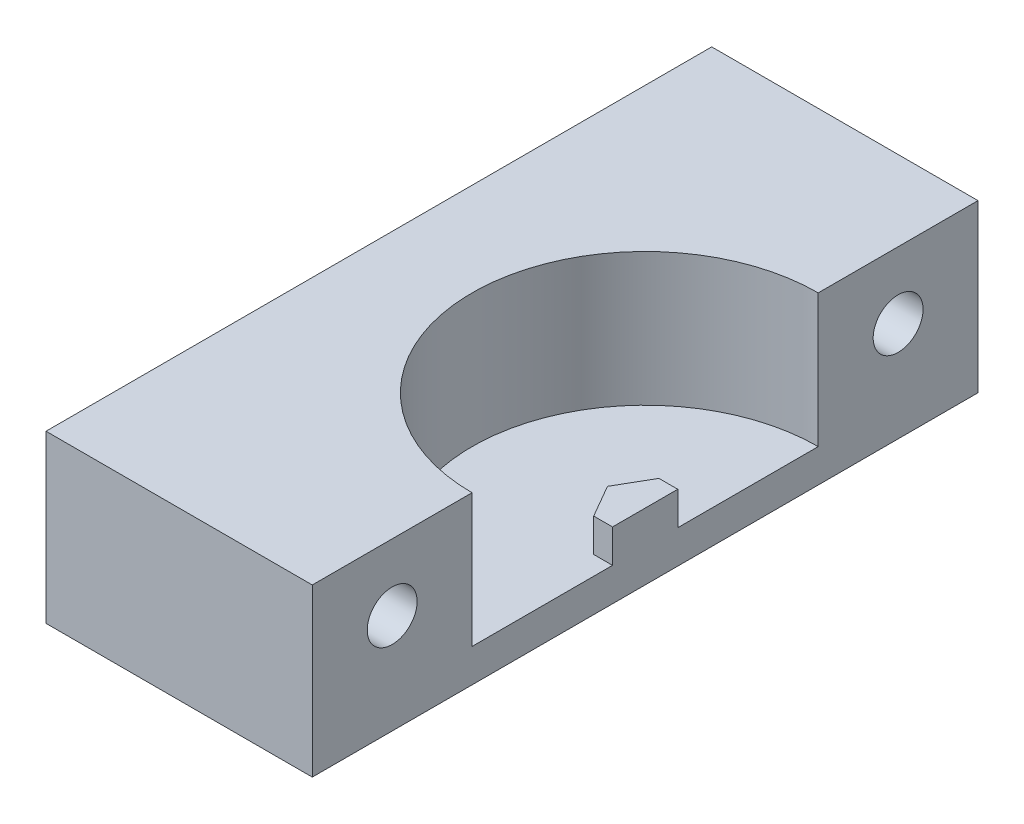
ISO-10303-21;
HEADER;
FILE_DESCRIPTION(('STEP AP214'),'2;1');
FILE_NAME('part.step','',(''),(''),'','','');
FILE_SCHEMA(('AUTOMOTIVE_DESIGN { 1 0 10303 214 1 1 1 1 }'));
ENDSEC;
DATA;
#1=APPLICATION_CONTEXT('core data for automotive mechanical design processes');
#2=APPLICATION_PROTOCOL_DEFINITION('international standard','automotive_design',2000,#1);
#3=PRODUCT_CONTEXT('',#1,'mechanical');
#4=PRODUCT('Part','Part','',(#3));
#5=PRODUCT_RELATED_PRODUCT_CATEGORY('part','',(#4));
#6=PRODUCT_DEFINITION_FORMATION('','',#4);
#7=PRODUCT_DEFINITION_CONTEXT('part definition',#1,'design');
#8=PRODUCT_DEFINITION('design','',#6,#7);
#9=PRODUCT_DEFINITION_SHAPE('','',#8);
#10=(LENGTH_UNIT() NAMED_UNIT(*) SI_UNIT(.MILLI.,.METRE.));
#11=(NAMED_UNIT(*) PLANE_ANGLE_UNIT() SI_UNIT($,.RADIAN.));
#12=(NAMED_UNIT(*) SI_UNIT($,.STERADIAN.) SOLID_ANGLE_UNIT());
#13=UNCERTAINTY_MEASURE_WITH_UNIT(LENGTH_MEASURE(1.E-05),#10,'distance_accuracy_value','');
#14=(GEOMETRIC_REPRESENTATION_CONTEXT(3) GLOBAL_UNCERTAINTY_ASSIGNED_CONTEXT((#13)) GLOBAL_UNIT_ASSIGNED_CONTEXT((#10,
#11,#12)) REPRESENTATION_CONTEXT('',''));
#15=CARTESIAN_POINT('',(0.,0.,0.));
#16=DIRECTION('',(0.,0.,1.));
#17=DIRECTION('',(1.,0.,0.));
#18=AXIS2_PLACEMENT_3D('',#15,#16,#17);
#19=CARTESIAN_POINT('',(0.,0.,0.));
#20=DIRECTION('',(0.,-1.,0.));
#21=DIRECTION('',(0.,0.,-1.));
#22=AXIS2_PLACEMENT_3D('',#19,#20,#21);
#23=PLANE('',#22);
#24=DIRECTION('',(-1.,0.,0.));
#25=VECTOR('',#24,1.);
#26=CARTESIAN_POINT('',(0.,0.,-6.223));
#27=LINE('',#26,#25);
#28=CARTESIAN_POINT('',(0.,0.,-6.223));
#29=VERTEX_POINT('',#28);
#30=CARTESIAN_POINT('',(-3.59285072516704,0.,-6.223));
#31=VERTEX_POINT('',#30);
#32=EDGE_CURVE('E212',#29,#31,#27,.T.);
#33=ORIENTED_EDGE('',*,*,#32,.F.);
#34=DIRECTION('',(0.,0.,1.));
#35=VECTOR('',#34,1.);
#36=CARTESIAN_POINT('',(0.,0.,63.5));
#37=LINE('',#36,#35);
#38=CARTESIAN_POINT('',(0.,0.,-33.02));
#39=VERTEX_POINT('',#38);
#40=EDGE_CURVE('E74',#39,#29,#37,.T.);
#41=ORIENTED_EDGE('',*,*,#40,.F.);
#42=CARTESIAN_POINT('',(0.,0.,0.));
#43=DIRECTION('',(0.,-1.,0.));
#44=DIRECTION('',(0.,0.,1.));
#45=AXIS2_PLACEMENT_3D('',#42,#43,#44);
#46=CIRCLE('',#45,33.02);
#47=CARTESIAN_POINT('',(0.,0.,33.02));
#48=VERTEX_POINT('',#47);
#49=EDGE_CURVE('E123',#48,#39,#46,.T.);
#50=ORIENTED_EDGE('',*,*,#49,.F.);
#51=CARTESIAN_POINT('',(0.,0.,6.223));
#52=VERTEX_POINT('',#51);
#53=EDGE_CURVE('E81',#52,#48,#37,.T.);
#54=ORIENTED_EDGE('',*,*,#53,.F.);
#55=DIRECTION('',(1.,0.,0.));
#56=VECTOR('',#55,1.);
#57=CARTESIAN_POINT('',(-3.59285072516703,0.,6.223));
#58=LINE('',#57,#56);
#59=CARTESIAN_POINT('',(-3.59285072516703,0.,6.223));
#60=VERTEX_POINT('',#59);
#61=EDGE_CURVE('E163',#60,#52,#58,.T.);
#62=ORIENTED_EDGE('',*,*,#61,.F.);
#63=DIRECTION('',(0.5,0.,0.866025403784438));
#64=VECTOR('',#63,1.);
#65=CARTESIAN_POINT('',(-7.18570145033408,0.,0.));
#66=LINE('',#65,#64);
#67=CARTESIAN_POINT('',(-7.18570145033408,0.,0.));
#68=VERTEX_POINT('',#67);
#69=EDGE_CURVE('E208',#68,#60,#66,.T.);
#70=ORIENTED_EDGE('',*,*,#69,.F.);
#71=DIRECTION('',(-0.5,0.,0.866025403784438));
#72=VECTOR('',#71,1.);
#73=CARTESIAN_POINT('',(-3.59285072516704,0.,-6.223));
#74=LINE('',#73,#72);
#75=EDGE_CURVE('E210',#31,#68,#74,.T.);
#76=ORIENTED_EDGE('',*,*,#75,.F.);
#77=EDGE_LOOP('',(#33,#41,#50,#54,#62,#70,#76));
#78=FACE_BOUND('',#77,.T.);
#79=ADVANCED_FACE('F37',(#78),#23,.F.);
#80=CARTESIAN_POINT('',(0.,25.4,0.));
#81=DIRECTION('',(0.,-1.,0.));
#82=DIRECTION('',(0.,0.,-1.));
#83=AXIS2_PLACEMENT_3D('',#80,#81,#82);
#84=CYLINDRICAL_SURFACE('',#83,33.02);
#85=ORIENTED_EDGE('',*,*,#49,.T.);
#86=DIRECTION('',(0.,-1.,0.));
#87=VECTOR('',#86,1.);
#88=CARTESIAN_POINT('',(0.,25.4,-33.02));
#89=LINE('',#88,#87);
#90=CARTESIAN_POINT('',(0.,25.4,-33.02));
#91=VERTEX_POINT('',#90);
#92=EDGE_CURVE('E11',#91,#39,#89,.T.);
#93=ORIENTED_EDGE('',*,*,#92,.F.);
#94=CARTESIAN_POINT('',(0.,25.4,0.));
#95=DIRECTION('',(0.,-1.,0.));
#96=DIRECTION('',(0.,0.,1.));
#97=AXIS2_PLACEMENT_3D('',#94,#95,#96);
#98=CIRCLE('',#97,33.02);
#99=CARTESIAN_POINT('',(0.,25.4,33.02));
#100=VERTEX_POINT('',#99);
#101=EDGE_CURVE('E126',#100,#91,#98,.T.);
#102=ORIENTED_EDGE('',*,*,#101,.F.);
#103=DIRECTION('',(0.,-1.,0.));
#104=VECTOR('',#103,1.);
#105=CARTESIAN_POINT('',(0.,25.4,33.02));
#106=LINE('',#105,#104);
#107=EDGE_CURVE('E119',#100,#48,#106,.T.);
#108=ORIENTED_EDGE('',*,*,#107,.T.);
#109=EDGE_LOOP('',(#85,#93,#102,#108));
#110=FACE_BOUND('',#109,.T.);
#111=ADVANCED_FACE('F39',(#110),#84,.F.);
#112=CARTESIAN_POINT('',(0.,25.4,-63.5));
#113=DIRECTION('',(0.,0.,1.));
#114=DIRECTION('',(1.,0.,0.));
#115=AXIS2_PLACEMENT_3D('',#112,#113,#114);
#116=PLANE('',#115);
#117=DIRECTION('',(0.,-1.,0.));
#118=VECTOR('',#117,1.);
#119=CARTESIAN_POINT('',(0.,25.4,-63.5));
#120=LINE('',#119,#118);
#121=CARTESIAN_POINT('',(0.,25.4,-63.5));
#122=VERTEX_POINT('',#121);
#123=CARTESIAN_POINT('',(0.,-6.35,-63.5));
#124=VERTEX_POINT('',#123);
#125=EDGE_CURVE('E45',#122,#124,#120,.T.);
#126=ORIENTED_EDGE('',*,*,#125,.T.);
#127=DIRECTION('',(1.,0.,0.));
#128=VECTOR('',#127,1.);
#129=CARTESIAN_POINT('',(-50.8,-6.35,-63.5));
#130=LINE('',#129,#128);
#131=CARTESIAN_POINT('',(-50.8,-6.35,-63.5));
#132=VERTEX_POINT('',#131);
#133=EDGE_CURVE('E139',#132,#124,#130,.T.);
#134=ORIENTED_EDGE('',*,*,#133,.F.);
#135=DIRECTION('',(0.,-1.,0.));
#136=VECTOR('',#135,1.);
#137=CARTESIAN_POINT('',(-50.8,25.4,-63.5));
#138=LINE('',#137,#136);
#139=CARTESIAN_POINT('',(-50.8,25.4,-63.5));
#140=VERTEX_POINT('',#139);
#141=EDGE_CURVE('E113',#140,#132,#138,.T.);
#142=ORIENTED_EDGE('',*,*,#141,.F.);
#143=DIRECTION('',(-1.,0.,0.));
#144=VECTOR('',#143,1.);
#145=CARTESIAN_POINT('',(0.,25.4,-63.5));
#146=LINE('',#145,#144);
#147=EDGE_CURVE('E100',#122,#140,#146,.T.);
#148=ORIENTED_EDGE('',*,*,#147,.F.);
#149=EDGE_LOOP('',(#126,#134,#142,#148));
#150=FACE_BOUND('',#149,.T.);
#151=ADVANCED_FACE('F137',(#150),#116,.F.);
#152=CARTESIAN_POINT('',(-50.8,25.4,-63.5));
#153=DIRECTION('',(1.,0.,0.));
#154=DIRECTION('',(0.,0.,-1.));
#155=AXIS2_PLACEMENT_3D('',#152,#153,#154);
#156=PLANE('',#155);
#157=CARTESIAN_POINT('',(-50.8,12.7,48.26));
#158=DIRECTION('',(1.,0.,0.));
#159=DIRECTION('',(0.,0.,-1.));
#160=AXIS2_PLACEMENT_3D('',#157,#158,#159);
#161=CIRCLE('',#160,4.7625);
#162=CARTESIAN_POINT('',(-50.8,12.7,43.4975));
#163=VERTEX_POINT('',#162);
#164=EDGE_CURVE('E164',#163,#163,#161,.T.);
#165=ORIENTED_EDGE('',*,*,#164,.T.);
#166=EDGE_LOOP('',(#165));
#167=FACE_BOUND('',#166,.T.);
#168=CARTESIAN_POINT('',(-50.8,12.7,-48.26));
#169=DIRECTION('',(1.,0.,0.));
#170=DIRECTION('',(0.,0.,1.));
#171=AXIS2_PLACEMENT_3D('',#168,#169,#170);
#172=CIRCLE('',#171,4.7625);
#173=CARTESIAN_POINT('',(-50.8,12.7,-43.4975));
#174=VERTEX_POINT('',#173);
#175=EDGE_CURVE('E171',#174,#174,#172,.T.);
#176=ORIENTED_EDGE('',*,*,#175,.T.);
#177=EDGE_LOOP('',(#176));
#178=FACE_BOUND('',#177,.T.);
#179=ORIENTED_EDGE('',*,*,#141,.T.);
#180=DIRECTION('',(0.,0.,-1.));
#181=VECTOR('',#180,1.);
#182=CARTESIAN_POINT('',(-50.8,-6.35,63.5));
#183=LINE('',#182,#181);
#184=CARTESIAN_POINT('',(-50.8,-6.35,63.5));
#185=VERTEX_POINT('',#184);
#186=EDGE_CURVE('E109',#185,#132,#183,.T.);
#187=ORIENTED_EDGE('',*,*,#186,.F.);
#188=DIRECTION('',(0.,-1.,0.));
#189=VECTOR('',#188,1.);
#190=CARTESIAN_POINT('',(-50.8,25.4,63.5));
#191=LINE('',#190,#189);
#192=CARTESIAN_POINT('',(-50.8,25.4,63.5));
#193=VERTEX_POINT('',#192);
#194=EDGE_CURVE('E106',#193,#185,#191,.T.);
#195=ORIENTED_EDGE('',*,*,#194,.F.);
#196=DIRECTION('',(0.,0.,1.));
#197=VECTOR('',#196,1.);
#198=CARTESIAN_POINT('',(-50.8,25.4,-63.5));
#199=LINE('',#198,#197);
#200=EDGE_CURVE('E93',#140,#193,#199,.T.);
#201=ORIENTED_EDGE('',*,*,#200,.F.);
#202=EDGE_LOOP('',(#179,#187,#195,#201));
#203=FACE_BOUND('',#202,.T.);
#204=ADVANCED_FACE('F107',(#167,#178,#203),#156,.F.);
#205=CARTESIAN_POINT('',(-50.8,25.4,63.5));
#206=DIRECTION('',(0.,0.,-1.));
#207=DIRECTION('',(-1.,0.,0.));
#208=AXIS2_PLACEMENT_3D('',#205,#206,#207);
#209=PLANE('',#208);
#210=ORIENTED_EDGE('',*,*,#194,.T.);
#211=DIRECTION('',(-1.,0.,0.));
#212=VECTOR('',#211,1.);
#213=CARTESIAN_POINT('',(-50.8,-6.35,63.5));
#214=LINE('',#213,#212);
#215=CARTESIAN_POINT('',(0.,-6.35,63.5));
#216=VERTEX_POINT('',#215);
#217=EDGE_CURVE('E127',#216,#185,#214,.T.);
#218=ORIENTED_EDGE('',*,*,#217,.F.);
#219=DIRECTION('',(0.,-1.,0.));
#220=VECTOR('',#219,1.);
#221=CARTESIAN_POINT('',(0.,25.4,63.5));
#222=LINE('',#221,#220);
#223=CARTESIAN_POINT('',(0.,25.4,63.5));
#224=VERTEX_POINT('',#223);
#225=EDGE_CURVE('E114',#224,#216,#222,.T.);
#226=ORIENTED_EDGE('',*,*,#225,.F.);
#227=DIRECTION('',(1.,0.,0.));
#228=VECTOR('',#227,1.);
#229=CARTESIAN_POINT('',(-50.8,25.4,63.5));
#230=LINE('',#229,#228);
#231=EDGE_CURVE('E97',#193,#224,#230,.T.);
#232=ORIENTED_EDGE('',*,*,#231,.F.);
#233=EDGE_LOOP('',(#210,#218,#226,#232));
#234=FACE_BOUND('',#233,.T.);
#235=ADVANCED_FACE('F116',(#234),#209,.F.);
#236=CARTESIAN_POINT('',(0.,25.4,63.5));
#237=DIRECTION('',(-1.,0.,0.));
#238=DIRECTION('',(0.,0.,1.));
#239=AXIS2_PLACEMENT_3D('',#236,#237,#238);
#240=PLANE('',#239);
#241=CARTESIAN_POINT('',(0.,12.7,48.26));
#242=DIRECTION('',(1.,0.,0.));
#243=DIRECTION('',(0.,0.,-1.));
#244=AXIS2_PLACEMENT_3D('',#241,#242,#243);
#245=CIRCLE('',#244,4.7625);
#246=CARTESIAN_POINT('',(0.,12.7,43.4975));
#247=VERTEX_POINT('',#246);
#248=EDGE_CURVE('E166',#247,#247,#245,.T.);
#249=ORIENTED_EDGE('',*,*,#248,.F.);
#250=EDGE_LOOP('',(#249));
#251=FACE_BOUND('',#250,.T.);
#252=CARTESIAN_POINT('',(0.,12.7,-48.26));
#253=DIRECTION('',(1.,0.,0.));
#254=DIRECTION('',(0.,0.,1.));
#255=AXIS2_PLACEMENT_3D('',#252,#253,#254);
#256=CIRCLE('',#255,4.7625);
#257=CARTESIAN_POINT('',(0.,12.7,-43.4975));
#258=VERTEX_POINT('',#257);
#259=EDGE_CURVE('E179',#258,#258,#256,.T.);
#260=ORIENTED_EDGE('',*,*,#259,.F.);
#261=EDGE_LOOP('',(#260));
#262=FACE_BOUND('',#261,.T.);
#263=ORIENTED_EDGE('',*,*,#225,.T.);
#264=DIRECTION('',(0.,0.,1.));
#265=VECTOR('',#264,1.);
#266=CARTESIAN_POINT('',(0.,-6.35,63.5));
#267=LINE('',#266,#265);
#268=EDGE_CURVE('E145',#124,#216,#267,.T.);
#269=ORIENTED_EDGE('',*,*,#268,.F.);
#270=ORIENTED_EDGE('',*,*,#125,.F.);
#271=DIRECTION('',(0.,0.,-1.));
#272=VECTOR('',#271,1.);
#273=CARTESIAN_POINT('',(0.,25.4,-33.02));
#274=LINE('',#273,#272);
#275=EDGE_CURVE('E154',#91,#122,#274,.T.);
#276=ORIENTED_EDGE('',*,*,#275,.F.);
#277=ORIENTED_EDGE('',*,*,#92,.T.);
#278=ORIENTED_EDGE('',*,*,#40,.T.);
#279=DIRECTION('',(0.,-1.,0.));
#280=VECTOR('',#279,1.);
#281=CARTESIAN_POINT('',(0.,6.35,-6.223));
#282=LINE('',#281,#280);
#283=CARTESIAN_POINT('',(0.,6.35,-6.223));
#284=VERTEX_POINT('',#283);
#285=EDGE_CURVE('E202',#284,#29,#282,.T.);
#286=ORIENTED_EDGE('',*,*,#285,.F.);
#287=DIRECTION('',(0.,0.,-1.));
#288=VECTOR('',#287,1.);
#289=CARTESIAN_POINT('',(0.,6.35,-6.223));
#290=LINE('',#289,#288);
#291=CARTESIAN_POINT('',(0.,6.35,6.223));
#292=VERTEX_POINT('',#291);
#293=EDGE_CURVE('E205',#292,#284,#290,.T.);
#294=ORIENTED_EDGE('',*,*,#293,.F.);
#295=DIRECTION('',(0.,-1.,0.));
#296=VECTOR('',#295,1.);
#297=CARTESIAN_POINT('',(0.,6.35,6.223));
#298=LINE('',#297,#296);
#299=EDGE_CURVE('E52',#292,#52,#298,.T.);
#300=ORIENTED_EDGE('',*,*,#299,.T.);
#301=ORIENTED_EDGE('',*,*,#53,.T.);
#302=ORIENTED_EDGE('',*,*,#107,.F.);
#303=DIRECTION('',(0.,0.,-1.));
#304=VECTOR('',#303,1.);
#305=CARTESIAN_POINT('',(0.,25.4,63.5));
#306=LINE('',#305,#304);
#307=EDGE_CURVE('E61',#224,#100,#306,.T.);
#308=ORIENTED_EDGE('',*,*,#307,.F.);
#309=EDGE_LOOP('',(#263,#269,#270,#276,#277,#278,#286,#294,#300,#301,#302,#308));
#310=FACE_BOUND('',#309,.T.);
#311=ADVANCED_FACE('F147',(#251,#262,#310),#240,.F.);
#312=CARTESIAN_POINT('',(0.,25.4,0.));
#313=DIRECTION('',(0.,1.,0.));
#314=DIRECTION('',(0.,0.,1.));
#315=AXIS2_PLACEMENT_3D('',#312,#313,#314);
#316=PLANE('',#315);
#317=ORIENTED_EDGE('',*,*,#101,.T.);
#318=ORIENTED_EDGE('',*,*,#275,.T.);
#319=ORIENTED_EDGE('',*,*,#147,.T.);
#320=ORIENTED_EDGE('',*,*,#200,.T.);
#321=ORIENTED_EDGE('',*,*,#231,.T.);
#322=ORIENTED_EDGE('',*,*,#307,.T.);
#323=EDGE_LOOP('',(#317,#318,#319,#320,#321,#322));
#324=FACE_BOUND('',#323,.T.);
#325=ADVANCED_FACE('F95',(#324),#316,.T.);
#326=CARTESIAN_POINT('',(0.,-6.35,0.));
#327=DIRECTION('',(0.,-1.,0.));
#328=DIRECTION('',(0.,0.,-1.));
#329=AXIS2_PLACEMENT_3D('',#326,#327,#328);
#330=PLANE('',#329);
#331=ORIENTED_EDGE('',*,*,#186,.T.);
#332=ORIENTED_EDGE('',*,*,#133,.T.);
#333=ORIENTED_EDGE('',*,*,#268,.T.);
#334=ORIENTED_EDGE('',*,*,#217,.T.);
#335=EDGE_LOOP('',(#331,#332,#333,#334));
#336=FACE_BOUND('',#335,.T.);
#337=ADVANCED_FACE('F144',(#336),#330,.T.);
#338=CARTESIAN_POINT('',(-50.8,12.7,-48.26));
#339=DIRECTION('',(1.,0.,0.));
#340=DIRECTION('',(0.,0.,-1.));
#341=AXIS2_PLACEMENT_3D('',#338,#339,#340);
#342=CYLINDRICAL_SURFACE('',#341,4.7625);
#343=ORIENTED_EDGE('',*,*,#175,.F.);
#344=EDGE_LOOP('',(#343));
#345=FACE_BOUND('',#344,.T.);
#346=ORIENTED_EDGE('',*,*,#259,.T.);
#347=EDGE_LOOP('',(#346));
#348=FACE_BOUND('',#347,.T.);
#349=ADVANCED_FACE('F306',(#345,#348),#342,.F.);
#350=CARTESIAN_POINT('',(-50.8,12.7,48.26));
#351=DIRECTION('',(1.,0.,0.));
#352=DIRECTION('',(0.,0.,-1.));
#353=AXIS2_PLACEMENT_3D('',#350,#351,#352);
#354=CYLINDRICAL_SURFACE('',#353,4.7625);
#355=ORIENTED_EDGE('',*,*,#164,.F.);
#356=EDGE_LOOP('',(#355));
#357=FACE_BOUND('',#356,.T.);
#358=ORIENTED_EDGE('',*,*,#248,.T.);
#359=EDGE_LOOP('',(#358));
#360=FACE_BOUND('',#359,.T.);
#361=ADVANCED_FACE('F311',(#357,#360),#354,.F.);
#362=CARTESIAN_POINT('',(0.,6.35,-6.223));
#363=DIRECTION('',(0.,0.,1.));
#364=DIRECTION('',(1.,0.,0.));
#365=AXIS2_PLACEMENT_3D('',#362,#363,#364);
#366=PLANE('',#365);
#367=ORIENTED_EDGE('',*,*,#32,.T.);
#368=DIRECTION('',(0.,-1.,0.));
#369=VECTOR('',#368,1.);
#370=CARTESIAN_POINT('',(-3.59285072516704,6.35,-6.223));
#371=LINE('',#370,#369);
#372=CARTESIAN_POINT('',(-3.59285072516704,6.35,-6.223));
#373=VERTEX_POINT('',#372);
#374=EDGE_CURVE('E174',#373,#31,#371,.T.);
#375=ORIENTED_EDGE('',*,*,#374,.F.);
#376=DIRECTION('',(-1.,0.,0.));
#377=VECTOR('',#376,1.);
#378=CARTESIAN_POINT('',(0.,6.35,-6.223));
#379=LINE('',#378,#377);
#380=EDGE_CURVE('E207',#284,#373,#379,.T.);
#381=ORIENTED_EDGE('',*,*,#380,.F.);
#382=ORIENTED_EDGE('',*,*,#285,.T.);
#383=EDGE_LOOP('',(#367,#375,#381,#382));
#384=FACE_BOUND('',#383,.T.);
#385=ADVANCED_FACE('F234',(#384),#366,.F.);
#386=CARTESIAN_POINT('',(-3.59285072516704,6.35,-6.223));
#387=DIRECTION('',(0.866025403784439,0.,0.5));
#388=DIRECTION('',(0.5,0.,-0.866025403784439));
#389=AXIS2_PLACEMENT_3D('',#386,#387,#388);
#390=PLANE('',#389);
#391=ORIENTED_EDGE('',*,*,#75,.T.);
#392=DIRECTION('',(0.,-1.,0.));
#393=VECTOR('',#392,1.);
#394=CARTESIAN_POINT('',(-7.18570145033408,6.35,0.));
#395=LINE('',#394,#393);
#396=CARTESIAN_POINT('',(-7.18570145033408,6.35,0.));
#397=VERTEX_POINT('',#396);
#398=EDGE_CURVE('E184',#397,#68,#395,.T.);
#399=ORIENTED_EDGE('',*,*,#398,.F.);
#400=DIRECTION('',(-0.5,0.,0.866025403784438));
#401=VECTOR('',#400,1.);
#402=CARTESIAN_POINT('',(-3.59285072516704,6.35,-6.223));
#403=LINE('',#402,#401);
#404=EDGE_CURVE('E222',#373,#397,#403,.T.);
#405=ORIENTED_EDGE('',*,*,#404,.F.);
#406=ORIENTED_EDGE('',*,*,#374,.T.);
#407=EDGE_LOOP('',(#391,#399,#405,#406));
#408=FACE_BOUND('',#407,.T.);
#409=ADVANCED_FACE('F237',(#408),#390,.F.);
#410=CARTESIAN_POINT('',(-7.18570145033408,6.35,0.));
#411=DIRECTION('',(0.866025403784438,0.,-0.5));
#412=DIRECTION('',(-0.5,0.,-0.866025403784439));
#413=AXIS2_PLACEMENT_3D('',#410,#411,#412);
#414=PLANE('',#413);
#415=ORIENTED_EDGE('',*,*,#69,.T.);
#416=DIRECTION('',(0.,-1.,0.));
#417=VECTOR('',#416,1.);
#418=CARTESIAN_POINT('',(-3.59285072516703,6.35,6.223));
#419=LINE('',#418,#417);
#420=CARTESIAN_POINT('',(-3.59285072516703,6.35,6.223));
#421=VERTEX_POINT('',#420);
#422=EDGE_CURVE('E192',#421,#60,#419,.T.);
#423=ORIENTED_EDGE('',*,*,#422,.F.);
#424=DIRECTION('',(0.5,0.,0.866025403784438));
#425=VECTOR('',#424,1.);
#426=CARTESIAN_POINT('',(-7.18570145033408,6.35,0.));
#427=LINE('',#426,#425);
#428=EDGE_CURVE('E219',#397,#421,#427,.T.);
#429=ORIENTED_EDGE('',*,*,#428,.F.);
#430=ORIENTED_EDGE('',*,*,#398,.T.);
#431=EDGE_LOOP('',(#415,#423,#429,#430));
#432=FACE_BOUND('',#431,.T.);
#433=ADVANCED_FACE('F250',(#432),#414,.F.);
#434=CARTESIAN_POINT('',(-3.59285072516703,6.35,6.223));
#435=DIRECTION('',(0.,0.,-1.));
#436=DIRECTION('',(-1.,0.,0.));
#437=AXIS2_PLACEMENT_3D('',#434,#435,#436);
#438=PLANE('',#437);
#439=ORIENTED_EDGE('',*,*,#61,.T.);
#440=ORIENTED_EDGE('',*,*,#299,.F.);
#441=DIRECTION('',(1.,0.,0.));
#442=VECTOR('',#441,1.);
#443=CARTESIAN_POINT('',(-3.59285072516703,6.35,6.223));
#444=LINE('',#443,#442);
#445=EDGE_CURVE('E216',#421,#292,#444,.T.);
#446=ORIENTED_EDGE('',*,*,#445,.F.);
#447=ORIENTED_EDGE('',*,*,#422,.T.);
#448=EDGE_LOOP('',(#439,#440,#446,#447));
#449=FACE_BOUND('',#448,.T.);
#450=ADVANCED_FACE('F252',(#449),#438,.F.);
#451=CARTESIAN_POINT('',(0.,6.35,0.));
#452=DIRECTION('',(0.,1.,0.));
#453=DIRECTION('',(0.,0.,1.));
#454=AXIS2_PLACEMENT_3D('',#451,#452,#453);
#455=PLANE('',#454);
#456=ORIENTED_EDGE('',*,*,#380,.T.);
#457=ORIENTED_EDGE('',*,*,#404,.T.);
#458=ORIENTED_EDGE('',*,*,#428,.T.);
#459=ORIENTED_EDGE('',*,*,#445,.T.);
#460=ORIENTED_EDGE('',*,*,#293,.T.);
#461=EDGE_LOOP('',(#456,#457,#458,#459,#460));
#462=FACE_BOUND('',#461,.T.);
#463=ADVANCED_FACE('F229',(#462),#455,.T.);
#464=CLOSED_SHELL('',(#79,#111,#151,#204,#235,#311,#325,#337,#349,#361,#385,#409,#433,#450,#463));
#465=MANIFOLD_SOLID_BREP('B2',#464);
#466=ADVANCED_BREP_SHAPE_REPRESENTATION('',(#18,#465),#14);
#467=SHAPE_DEFINITION_REPRESENTATION(#9,#466);
ENDSEC;
END-ISO-10303-21;
